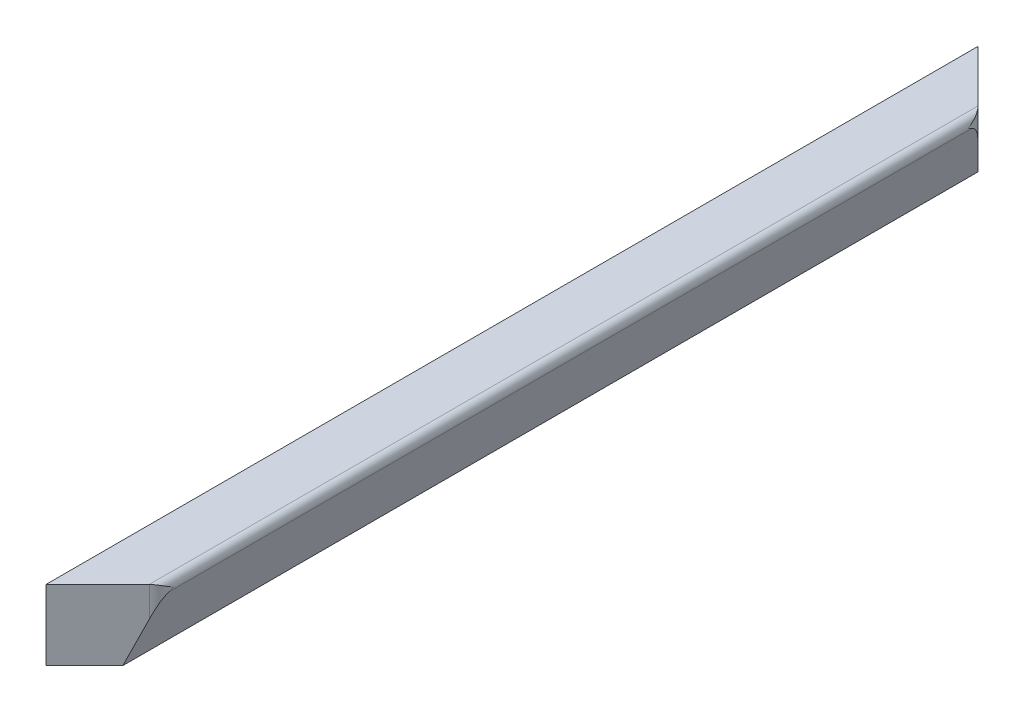
ISO-10303-21;
HEADER;
FILE_DESCRIPTION(('STEP AP214'),'2;1');
FILE_NAME('part.step','',(''),(''),'','','');
FILE_SCHEMA(('AUTOMOTIVE_DESIGN { 1 0 10303 214 1 1 1 1 }'));
ENDSEC;
DATA;
#1=APPLICATION_CONTEXT('core data for automotive mechanical design processes');
#2=APPLICATION_PROTOCOL_DEFINITION('international standard','automotive_design',2000,#1);
#3=PRODUCT_CONTEXT('',#1,'mechanical');
#4=PRODUCT('Part','Part','',(#3));
#5=PRODUCT_RELATED_PRODUCT_CATEGORY('part','',(#4));
#6=PRODUCT_DEFINITION_FORMATION('','',#4);
#7=PRODUCT_DEFINITION_CONTEXT('part definition',#1,'design');
#8=PRODUCT_DEFINITION('design','',#6,#7);
#9=PRODUCT_DEFINITION_SHAPE('','',#8);
#10=(LENGTH_UNIT() NAMED_UNIT(*) SI_UNIT(.MILLI.,.METRE.));
#11=(NAMED_UNIT(*) PLANE_ANGLE_UNIT() SI_UNIT($,.RADIAN.));
#12=(NAMED_UNIT(*) SI_UNIT($,.STERADIAN.) SOLID_ANGLE_UNIT());
#13=UNCERTAINTY_MEASURE_WITH_UNIT(LENGTH_MEASURE(1.E-05),#10,'distance_accuracy_value','');
#14=(GEOMETRIC_REPRESENTATION_CONTEXT(3) GLOBAL_UNCERTAINTY_ASSIGNED_CONTEXT((#13)) GLOBAL_UNIT_ASSIGNED_CONTEXT((#10,
#11,#12)) REPRESENTATION_CONTEXT('',''));
#15=CARTESIAN_POINT('',(0.,0.,0.));
#16=DIRECTION('',(0.,0.,1.));
#17=DIRECTION('',(1.,0.,0.));
#18=AXIS2_PLACEMENT_3D('',#15,#16,#17);
#19=CARTESIAN_POINT('',(-24.95,2.06586533746107,-38.82833835));
#20=DIRECTION('',(0.,-1.,0.));
#21=DIRECTION('',(0.,0.,-1.));
#22=AXIS2_PLACEMENT_3D('',#19,#20,#21);
#23=PLANE('',#22);
#24=DIRECTION('',(0.707106781186548,0.,0.707106781186548));
#25=VECTOR('',#24,1.);
#26=CARTESIAN_POINT('',(-24.95,2.06586533746107,-38.82833835));
#27=LINE('',#26,#25);
#28=CARTESIAN_POINT('',(-24.95,2.06586533746107,-38.82833835));
#29=VERTEX_POINT('',#28);
#30=CARTESIAN_POINT('',(-23.35,2.06586533746107,-37.22833835));
#31=VERTEX_POINT('',#30);
#32=EDGE_CURVE('E54',#29,#31,#27,.T.);
#33=ORIENTED_EDGE('',*,*,#32,.T.);
#34=DIRECTION('',(0.,0.,1.));
#35=VECTOR('',#34,1.);
#36=CARTESIAN_POINT('',(-23.35,2.06586533746107,-38.82833835));
#37=LINE('',#36,#35);
#38=CARTESIAN_POINT('',(-23.35,2.06586533746107,-1.6));
#39=VERTEX_POINT('',#38);
#40=EDGE_CURVE('E106',#31,#39,#37,.T.);
#41=ORIENTED_EDGE('',*,*,#40,.T.);
#42=DIRECTION('',(-0.707106781186549,0.,0.707106781186546));
#43=VECTOR('',#42,1.);
#44=CARTESIAN_POINT('',(-22.7928932188135,2.06586533746107,-2.15710678118652));
#45=LINE('',#44,#43);
#46=CARTESIAN_POINT('',(-24.95,2.06586533746107,0.));
#47=VERTEX_POINT('',#46);
#48=EDGE_CURVE('E174',#39,#47,#45,.T.);
#49=ORIENTED_EDGE('',*,*,#48,.T.);
#50=DIRECTION('',(0.,0.,1.));
#51=VECTOR('',#50,1.);
#52=CARTESIAN_POINT('',(-24.95,2.06586533746107,-38.82833835));
#53=LINE('',#52,#51);
#54=EDGE_CURVE('E123',#29,#47,#53,.T.);
#55=ORIENTED_EDGE('',*,*,#54,.F.);
#56=EDGE_LOOP('',(#33,#41,#49,#55));
#57=FACE_BOUND('',#56,.T.);
#58=ADVANCED_FACE('F39',(#57),#23,.T.);
#59=CARTESIAN_POINT('',(-24.95,2.06586533746107,-38.82833835));
#60=DIRECTION('',(-1.,0.,0.));
#61=DIRECTION('',(0.,0.,1.));
#62=AXIS2_PLACEMENT_3D('',#59,#60,#61);
#63=PLANE('',#62);
#64=DIRECTION('',(0.,-1.,0.));
#65=VECTOR('',#64,1.);
#66=CARTESIAN_POINT('',(-24.95,2.06586533746107,0.));
#67=LINE('',#66,#65);
#68=CARTESIAN_POINT('',(-24.95,4.99586533746107,0.));
#69=VERTEX_POINT('',#68);
#70=EDGE_CURVE('E107',#69,#47,#67,.T.);
#71=ORIENTED_EDGE('',*,*,#70,.F.);
#72=DIRECTION('',(0.,0.,1.));
#73=VECTOR('',#72,1.);
#74=CARTESIAN_POINT('',(-24.95,4.99586533746107,-38.82833835));
#75=LINE('',#74,#73);
#76=CARTESIAN_POINT('',(-24.95,4.99586533746109,-38.82833835));
#77=VERTEX_POINT('',#76);
#78=EDGE_CURVE('E114',#77,#69,#75,.T.);
#79=ORIENTED_EDGE('',*,*,#78,.F.);
#80=DIRECTION('',(0.,-1.,0.));
#81=VECTOR('',#80,1.);
#82=CARTESIAN_POINT('',(-24.95,2.06586533746107,-38.82833835));
#83=LINE('',#82,#81);
#84=EDGE_CURVE('E97',#77,#29,#83,.T.);
#85=ORIENTED_EDGE('',*,*,#84,.T.);
#86=ORIENTED_EDGE('',*,*,#54,.T.);
#87=EDGE_LOOP('',(#71,#79,#85,#86));
#88=FACE_BOUND('',#87,.T.);
#89=ADVANCED_FACE('F121',(#88),#63,.T.);
#90=CARTESIAN_POINT('',(-24.95,4.99586533746107,-38.82833835));
#91=DIRECTION('',(0.,1.,0.));
#92=DIRECTION('',(-1.,0.,0.));
#93=AXIS2_PLACEMENT_3D('',#90,#91,#92);
#94=PLANE('',#93);
#95=DIRECTION('',(0.707106781186547,0.,0.707106781186547));
#96=VECTOR('',#95,1.);
#97=CARTESIAN_POINT('',(-24.95,4.99586533746109,-38.82833835));
#98=LINE('',#97,#96);
#99=CARTESIAN_POINT('',(-22.8,4.99586533746107,-36.67833835));
#100=VERTEX_POINT('',#99);
#101=EDGE_CURVE('E100',#77,#100,#98,.T.);
#102=ORIENTED_EDGE('',*,*,#101,.F.);
#103=ORIENTED_EDGE('',*,*,#78,.T.);
#104=DIRECTION('',(-0.707106781186549,0.,0.707106781186546));
#105=VECTOR('',#104,1.);
#106=CARTESIAN_POINT('',(-22.7928932188135,4.99586533746109,-2.15710678118653));
#107=LINE('',#106,#105);
#108=CARTESIAN_POINT('',(-22.8,4.99586533746107,-2.15));
#109=VERTEX_POINT('',#108);
#110=EDGE_CURVE('E119',#109,#69,#107,.T.);
#111=ORIENTED_EDGE('',*,*,#110,.F.);
#112=DIRECTION('',(0.,0.,1.));
#113=VECTOR('',#112,1.);
#114=CARTESIAN_POINT('',(-22.8,4.99586533746107,-38.82833835));
#115=LINE('',#114,#113);
#116=EDGE_CURVE('E117',#100,#109,#115,.T.);
#117=ORIENTED_EDGE('',*,*,#116,.F.);
#118=EDGE_LOOP('',(#102,#103,#111,#117));
#119=FACE_BOUND('',#118,.T.);
#120=ADVANCED_FACE('F112',(#119),#94,.T.);
#121=CARTESIAN_POINT('',(-22.8,4.69586533746107,-38.82833835));
#122=DIRECTION('',(0.,0.,1.));
#123=DIRECTION('',(1.,0.,0.));
#124=AXIS2_PLACEMENT_3D('',#121,#122,#123);
#125=CYLINDRICAL_SURFACE('',#124,0.3);
#126=CARTESIAN_POINT('',(-22.5150450348908,4.60205346262835,-36.1369360045856));
#127=CARTESIAN_POINT('',(-22.5101695599614,4.61687582427971,-36.1091274782535));
#128=CARTESIAN_POINT('',(-22.5064860231525,4.6319434807412,-36.0812344079817));
#129=CARTESIAN_POINT('',(-22.5014895568805,4.66228291313871,-36.025449206945));
#130=CARTESIAN_POINT('',(-22.5001699603138,4.67755399224517,-35.997557296099));
#131=CARTESIAN_POINT('',(-22.5000051351727,4.69383987534687,-35.9678227639942));
#132=CARTESIAN_POINT('',(-22.5000000078866,4.69485261945741,-35.9659737551205));
#133=CARTESIAN_POINT('',(-22.5,4.69586533746107,-35.9641247876269));
#134=B_SPLINE_CURVE_WITH_KNOTS('',3,(#126,#127,#128,#129,#130,#131,#132,#133),.UNSPECIFIED.,.F.,
.F.,(4,2,2,4),(0.,0.0956516684746443,0.191033139922332,0.197357713954839),.UNSPECIFIED.);
#135=CARTESIAN_POINT('',(-22.5,4.69586533746105,-35.9641247876269));
#136=VERTEX_POINT('',#135);
#137=CARTESIAN_POINT('',(-22.5150450348908,4.60205346262835,-36.1369360045857));
#138=VERTEX_POINT('',#137);
#139=EDGE_CURVE('E169',#136,#138,#134,.F.);
#140=ORIENTED_EDGE('',*,*,#139,.F.);
#141=CARTESIAN_POINT('',(-22.7928932188135,4.99578114841668,-36.6712315688135));
#142=CARTESIAN_POINT('',(-22.7807913347075,4.99549012642972,-36.6591326835736));
#143=CARTESIAN_POINT('',(-22.7690255735454,4.99448346577498,-36.6467426889309));
#144=CARTESIAN_POINT('',(-22.74623816342,4.99123354278876,-36.6214913020005));
#145=CARTESIAN_POINT('',(-22.7352151373507,4.98899264386436,-36.608630854373));
#146=CARTESIAN_POINT('',(-22.7034944019142,4.98075364189259,-36.5696769023432));
#147=CARTESIAN_POINT('',(-22.6839228451336,4.97322675165618,-36.5429870846669));
#148=CARTESIAN_POINT('',(-22.6389736144886,4.95077757314726,-36.4750276099454));
#149=CARTESIAN_POINT('',(-22.6155344391367,4.93403892123878,-36.4330954619395));
#150=CARTESIAN_POINT('',(-22.5752627309358,4.8965004357438,-36.3476711177337));
#151=CARTESIAN_POINT('',(-22.558469902649,4.87567727468819,-36.3041711909284));
#152=CARTESIAN_POINT('',(-22.5300027737823,4.82965420675126,-36.2123650961732));
#153=CARTESIAN_POINT('',(-22.5189424624841,4.80422782365902,-36.1639853080958));
#154=CARTESIAN_POINT('',(-22.5040940766678,4.75216364197601,-36.0669448004396));
#155=CARTESIAN_POINT('',(-22.50028482102,4.72552960515681,-36.0182853168541));
#156=CARTESIAN_POINT('',(-22.5000051364548,4.69789077880832,-35.9678227253845));
#157=CARTESIAN_POINT('',(-22.5000000093673,4.6968780345413,-35.9659737162022));
#158=CARTESIAN_POINT('',(-22.5,4.69586533746107,-35.9641247876269));
#159=B_SPLINE_CURVE_WITH_KNOTS('',3,(#141,#142,#143,#144,#145,#146,#147,#148,#149,#150,#151,
#152,#153,#154,#155,#156,#157,#158),.UNSPECIFIED.,.F.,.F.,(4,2,2,2,2,2,2,2,4),(0.,
0.0512939373216549,0.102489993142604,0.203947417205957,0.355753185055912,0.508452609896271,
0.675218054656655,0.841495607180408,0.847820181213404),.UNSPECIFIED.);
#160=CARTESIAN_POINT('',(-22.7928932188135,4.99578114841665,-36.6712315688135));
#161=VERTEX_POINT('',#160);
#162=EDGE_CURVE('E218',#161,#136,#159,.T.);
#163=ORIENTED_EDGE('',*,*,#162,.F.);
#164=CARTESIAN_POINT('',(-22.8,4.69586533746107,-36.67833835));
#165=DIRECTION('',(-0.707106781186548,0.,0.707106781186548));
#166=DIRECTION('',(0.707106781186548,0.,0.707106781186548));
#167=AXIS2_PLACEMENT_3D('',#164,#165,#166);
#168=ELLIPSE('',#167,0.424264068711929,0.3);
#169=EDGE_CURVE('E156',#100,#161,#168,.F.);
#170=ORIENTED_EDGE('',*,*,#169,.F.);
#171=ORIENTED_EDGE('',*,*,#116,.T.);
#172=CARTESIAN_POINT('',(-22.8,4.69586533746107,-2.15));
#173=DIRECTION('',(-0.707106781186546,0.,-0.707106781186549));
#174=DIRECTION('',(-0.707106781186549,0.,0.707106781186546));
#175=AXIS2_PLACEMENT_3D('',#172,#173,#174);
#176=ELLIPSE('',#175,0.424264068711928,0.3);
#177=CARTESIAN_POINT('',(-22.7928932188135,4.99578114841667,-2.15710678118653));
#178=VERTEX_POINT('',#177);
#179=EDGE_CURVE('E182',#178,#109,#176,.F.);
#180=ORIENTED_EDGE('',*,*,#179,.F.);
#181=CARTESIAN_POINT('',(-22.7928932188135,4.99578114841668,-2.15710678118653));
#182=CARTESIAN_POINT('',(-22.7807913347075,4.99549012642971,-2.16920566642636));
#183=CARTESIAN_POINT('',(-22.7690255735455,4.99448346577498,-2.18159566106908));
#184=CARTESIAN_POINT('',(-22.74623816342,4.99123354278877,-2.20684704799943));
#185=CARTESIAN_POINT('',(-22.7352151373507,4.98899264386438,-2.2197074956269));
#186=CARTESIAN_POINT('',(-22.7034944019143,4.98075364189261,-2.25866144765675));
#187=CARTESIAN_POINT('',(-22.6839228451336,4.97322675165618,-2.28535126533305));
#188=CARTESIAN_POINT('',(-22.6389736144886,4.95077757314726,-2.35331074005459));
#189=CARTESIAN_POINT('',(-22.6155344391366,4.93403892123882,-2.39524288806059));
#190=CARTESIAN_POINT('',(-22.5752627309358,4.8965004357437,-2.48066723226633));
#191=CARTESIAN_POINT('',(-22.558469902649,4.87567727468791,-2.52416715907149));
#192=CARTESIAN_POINT('',(-22.5300027737823,4.82965420675154,-2.61597325382689));
#193=CARTESIAN_POINT('',(-22.5189424624841,4.80422782366012,-2.66435304190478));
#194=CARTESIAN_POINT('',(-22.5040940766678,4.75216364197491,-2.7613935495598));
#195=CARTESIAN_POINT('',(-22.50028482102,4.72552960515269,-2.8100530331436));
#196=CARTESIAN_POINT('',(-22.5000051364548,4.69789077880801,-2.86051562461534));
#197=CARTESIAN_POINT('',(-22.5000000093673,4.69687803454114,-2.86236463379767));
#198=CARTESIAN_POINT('',(-22.5,4.69586533746107,-2.86421356237308));
#199=B_SPLINE_CURVE_WITH_KNOTS('',3,(#181,#182,#183,#184,#185,#186,#187,#188,#189,#190,#191,
#192,#193,#194,#195,#196,#197,#198),.UNSPECIFIED.,.F.,.F.,(4,2,2,2,2,2,2,2,4),(0.,
0.0512939373215906,0.102489993142474,0.203947417205966,0.355753185056008,0.50845260989627,
0.675218054656624,0.841495607180426,0.847820181213412),.UNSPECIFIED.);
#200=CARTESIAN_POINT('',(-22.5,4.69586533746105,-2.86421356237309));
#201=VERTEX_POINT('',#200);
#202=EDGE_CURVE('E154',#201,#178,#199,.F.);
#203=ORIENTED_EDGE('',*,*,#202,.F.);
#204=CARTESIAN_POINT('',(-22.5150450348908,4.60205346262835,-2.69140234541431));
#205=CARTESIAN_POINT('',(-22.5101695599614,4.61687582427732,-2.71921087174783));
#206=CARTESIAN_POINT('',(-22.5064860231525,4.63194348073998,-2.74710394201891));
#207=CARTESIAN_POINT('',(-22.5014895568805,4.66228291313997,-2.80288914305433));
#208=CARTESIAN_POINT('',(-22.5001699603138,4.67755399224773,-2.83078105389965));
#209=CARTESIAN_POINT('',(-22.5000051351727,4.6938398753472,-2.86051558600567));
#210=CARTESIAN_POINT('',(-22.5000000078866,4.69485261945759,-2.86236459487942));
#211=CARTESIAN_POINT('',(-22.5,4.69586533746107,-2.86421356237308));
#212=B_SPLINE_CURVE_WITH_KNOTS('',3,(#204,#205,#206,#207,#208,#209,#210,#211),.UNSPECIFIED.,.F.,
.F.,(4,2,2,4),(0.,0.0956516684746646,0.191033139922378,0.197357713954877),.UNSPECIFIED.);
#213=CARTESIAN_POINT('',(-22.5150450348908,4.60205346262835,-2.69140234541431));
#214=VERTEX_POINT('',#213);
#215=EDGE_CURVE('E143',#214,#201,#212,.T.);
#216=ORIENTED_EDGE('',*,*,#215,.F.);
#217=DIRECTION('',(0.,0.,1.));
#218=VECTOR('',#217,1.);
#219=CARTESIAN_POINT('',(-22.5150450348908,4.60205346262835,-38.82833835));
#220=LINE('',#219,#218);
#221=EDGE_CURVE('E128',#138,#214,#220,.T.);
#222=ORIENTED_EDGE('',*,*,#221,.F.);
#223=EDGE_LOOP('',(#140,#163,#170,#171,#180,#203,#216,#222));
#224=FACE_BOUND('',#223,.T.);
#225=ADVANCED_FACE('F152',(#224),#125,.T.);
#226=CARTESIAN_POINT('',(-23.35,2.06586533746107,-38.82833835));
#227=DIRECTION('',(0.949849883697247,-0.312706249442389,0.));
#228=DIRECTION('',(0.312706249442389,0.949849883697247,0.));
#229=AXIS2_PLACEMENT_3D('',#226,#227,#228);
#230=PLANE('',#229);
#231=DIRECTION('',(-0.298454323980183,-0.906559448130713,-0.298454323980183));
#232=VECTOR('',#231,1.);
#233=CARTESIAN_POINT('',(-23.492519973604,1.63295879787754,-37.3708583236039));
#234=LINE('',#233,#232);
#235=CARTESIAN_POINT('',(-22.7928932188135,3.75808547140649,-36.6712315688135));
#236=VERTEX_POINT('',#235);
#237=EDGE_CURVE('E162',#236,#31,#234,.T.);
#238=ORIENTED_EDGE('',*,*,#237,.F.);
#239=CARTESIAN_POINT('',(-23.5,1.61023810644581,-35.9641247876269));
#240=DIRECTION('',(0.949849883697247,-0.312706249442389,0.));
#241=DIRECTION('',(0.312706249442389,0.949849883697247,0.));
#242=AXIS2_PLACEMENT_3D('',#239,#240,#241);
#243=ELLIPSE('',#242,3.19788939870302,0.999999999999999);
#244=EDGE_CURVE('E11',#138,#236,#243,.F.);
#245=ORIENTED_EDGE('',*,*,#244,.F.);
#246=ORIENTED_EDGE('',*,*,#221,.T.);
#247=CARTESIAN_POINT('',(-23.5,1.61023810644582,-2.86421356237308));
#248=DIRECTION('',(0.949849883697247,-0.312706249442389,0.));
#249=DIRECTION('',(0.312706249442389,0.949849883697247,0.));
#250=AXIS2_PLACEMENT_3D('',#247,#248,#249);
#251=ELLIPSE('',#250,3.19788939870303,1.);
#252=CARTESIAN_POINT('',(-22.7928932188135,3.75808547140651,-2.15710678118653));
#253=VERTEX_POINT('',#252);
#254=EDGE_CURVE('E48',#253,#214,#251,.F.);
#255=ORIENTED_EDGE('',*,*,#254,.F.);
#256=DIRECTION('',(0.298454323980184,0.906559448130714,-0.298454323980182));
#257=VECTOR('',#256,1.);
#258=CARTESIAN_POINT('',(-20.0338863756495,12.1386097934254,-4.91611362435052));
#259=LINE('',#258,#257);
#260=EDGE_CURVE('E179',#39,#253,#259,.T.);
#261=ORIENTED_EDGE('',*,*,#260,.F.);
#262=ORIENTED_EDGE('',*,*,#40,.F.);
#263=EDGE_LOOP('',(#238,#245,#246,#255,#261,#262));
#264=FACE_BOUND('',#263,.T.);
#265=ADVANCED_FACE('F160',(#264),#230,.T.);
#266=CARTESIAN_POINT('',(-22.7928932188135,-39.8685692794257,-2.15710678118653));
#267=DIRECTION('',(-0.707106781186546,0.,-0.707106781186549));
#268=DIRECTION('',(-0.707106781186549,0.,0.707106781186546));
#269=AXIS2_PLACEMENT_3D('',#266,#267,#268);
#270=PLANE('',#269);
#271=ORIENTED_EDGE('',*,*,#179,.T.);
#272=ORIENTED_EDGE('',*,*,#110,.T.);
#273=ORIENTED_EDGE('',*,*,#70,.T.);
#274=ORIENTED_EDGE('',*,*,#48,.F.);
#275=ORIENTED_EDGE('',*,*,#260,.T.);
#276=DIRECTION('',(0.,1.,0.));
#277=VECTOR('',#276,1.);
#278=CARTESIAN_POINT('',(-22.7928932188135,-39.8685692794257,-2.15710678118653));
#279=LINE('',#278,#277);
#280=EDGE_CURVE('E146',#253,#178,#279,.T.);
#281=ORIENTED_EDGE('',*,*,#280,.T.);
#282=EDGE_LOOP('',(#271,#272,#273,#274,#275,#281));
#283=FACE_BOUND('',#282,.T.);
#284=ADVANCED_FACE('F206',(#283),#270,.F.);
#285=CARTESIAN_POINT('',(-23.5,-39.8685692794257,-2.86421356237308));
#286=DIRECTION('',(0.,1.,0.));
#287=DIRECTION('',(-1.,0.,0.));
#288=AXIS2_PLACEMENT_3D('',#285,#286,#287);
#289=CYLINDRICAL_SURFACE('',#288,1.);
#290=ORIENTED_EDGE('',*,*,#202,.T.);
#291=ORIENTED_EDGE('',*,*,#280,.F.);
#292=ORIENTED_EDGE('',*,*,#254,.T.);
#293=ORIENTED_EDGE('',*,*,#215,.T.);
#294=EDGE_LOOP('',(#290,#291,#292,#293));
#295=FACE_BOUND('',#294,.T.);
#296=ADVANCED_FACE('F142',(#295),#289,.T.);
#297=CARTESIAN_POINT('',(-24.95,-39.8685692794257,-38.82833835));
#298=DIRECTION('',(-0.707106781186548,0.,0.707106781186548));
#299=DIRECTION('',(0.707106781186548,0.,0.707106781186548));
#300=AXIS2_PLACEMENT_3D('',#297,#298,#299);
#301=PLANE('',#300);
#302=ORIENTED_EDGE('',*,*,#169,.T.);
#303=DIRECTION('',(0.,1.,0.));
#304=VECTOR('',#303,1.);
#305=CARTESIAN_POINT('',(-22.7928932188135,-39.8685692794257,-36.6712315688135));
#306=LINE('',#305,#304);
#307=EDGE_CURVE('E167',#236,#161,#306,.T.);
#308=ORIENTED_EDGE('',*,*,#307,.F.);
#309=ORIENTED_EDGE('',*,*,#237,.T.);
#310=ORIENTED_EDGE('',*,*,#32,.F.);
#311=ORIENTED_EDGE('',*,*,#84,.F.);
#312=ORIENTED_EDGE('',*,*,#101,.T.);
#313=EDGE_LOOP('',(#302,#308,#309,#310,#311,#312));
#314=FACE_BOUND('',#313,.T.);
#315=ADVANCED_FACE('F99',(#314),#301,.F.);
#316=CARTESIAN_POINT('',(-23.5,-39.8685692794257,-35.9641247876269));
#317=DIRECTION('',(0.,1.,0.));
#318=DIRECTION('',(-1.,0.,0.));
#319=AXIS2_PLACEMENT_3D('',#316,#317,#318);
#320=CYLINDRICAL_SURFACE('',#319,0.999999999999999);
#321=ORIENTED_EDGE('',*,*,#162,.T.);
#322=ORIENTED_EDGE('',*,*,#139,.T.);
#323=ORIENTED_EDGE('',*,*,#244,.T.);
#324=ORIENTED_EDGE('',*,*,#307,.T.);
#325=EDGE_LOOP('',(#321,#322,#323,#324));
#326=FACE_BOUND('',#325,.T.);
#327=ADVANCED_FACE('F166',(#326),#320,.T.);
#328=CLOSED_SHELL('',(#58,#89,#120,#225,#265,#284,#296,#315,#327));
#329=MANIFOLD_SOLID_BREP('B2',#328);
#330=ADVANCED_BREP_SHAPE_REPRESENTATION('',(#18,#329),#14);
#331=SHAPE_DEFINITION_REPRESENTATION(#9,#330);
ENDSEC;
END-ISO-10303-21;
